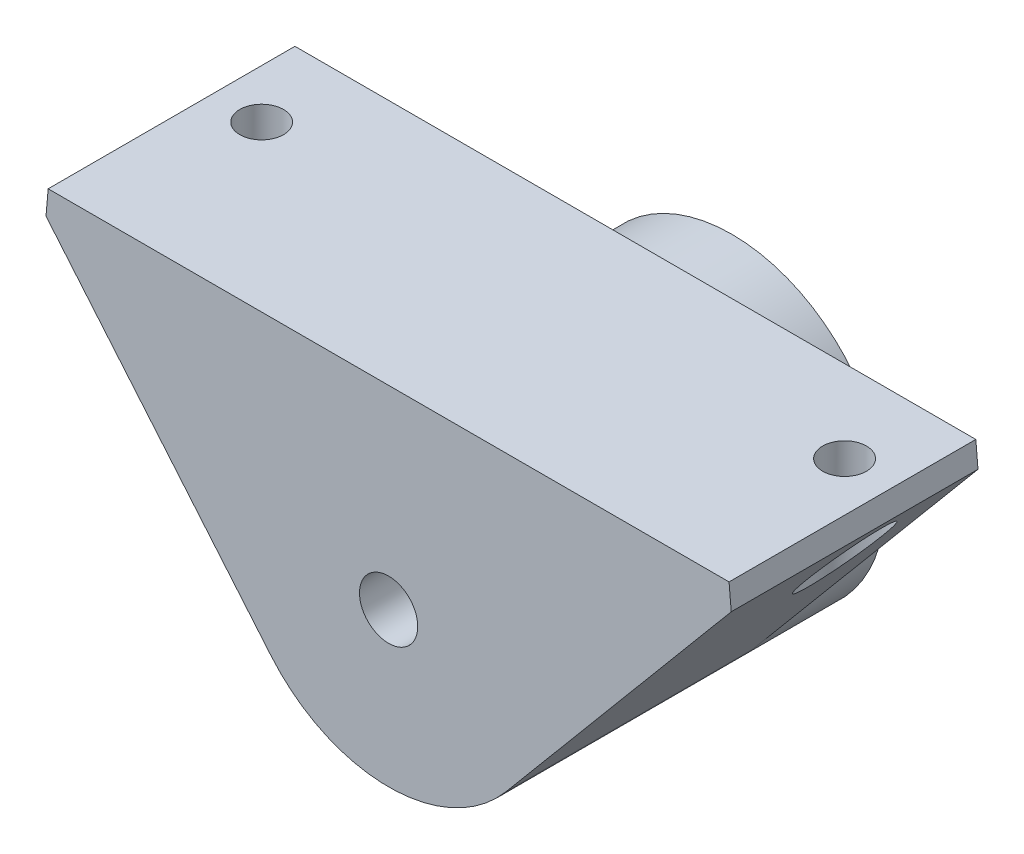
ISO-10303-21;
HEADER;
FILE_DESCRIPTION(('STEP AP214'),'2;1');
FILE_NAME('part.step','',(''),(''),'','','');
FILE_SCHEMA(('AUTOMOTIVE_DESIGN { 1 0 10303 214 1 1 1 1 }'));
ENDSEC;
DATA;
#1=APPLICATION_CONTEXT('core data for automotive mechanical design processes');
#2=APPLICATION_PROTOCOL_DEFINITION('international standard','automotive_design',2000,#1);
#3=PRODUCT_CONTEXT('',#1,'mechanical');
#4=PRODUCT('Part','Part','',(#3));
#5=PRODUCT_RELATED_PRODUCT_CATEGORY('part','',(#4));
#6=PRODUCT_DEFINITION_FORMATION('','',#4);
#7=PRODUCT_DEFINITION_CONTEXT('part definition',#1,'design');
#8=PRODUCT_DEFINITION('design','',#6,#7);
#9=PRODUCT_DEFINITION_SHAPE('','',#8);
#10=(LENGTH_UNIT() NAMED_UNIT(*) SI_UNIT(.MILLI.,.METRE.));
#11=(NAMED_UNIT(*) PLANE_ANGLE_UNIT() SI_UNIT($,.RADIAN.));
#12=(NAMED_UNIT(*) SI_UNIT($,.STERADIAN.) SOLID_ANGLE_UNIT());
#13=UNCERTAINTY_MEASURE_WITH_UNIT(LENGTH_MEASURE(1.E-05),#10,'distance_accuracy_value','');
#14=(GEOMETRIC_REPRESENTATION_CONTEXT(3) GLOBAL_UNCERTAINTY_ASSIGNED_CONTEXT((#13)) GLOBAL_UNIT_ASSIGNED_CONTEXT((#10,
#11,#12)) REPRESENTATION_CONTEXT('',''));
#15=CARTESIAN_POINT('',(0.,0.,0.));
#16=DIRECTION('',(0.,0.,1.));
#17=DIRECTION('',(1.,0.,0.));
#18=AXIS2_PLACEMENT_3D('',#15,#16,#17);
#19=CARTESIAN_POINT('',(0.,0.,-48.));
#20=DIRECTION('',(0.,0.,1.));
#21=DIRECTION('',(1.,0.,0.));
#22=AXIS2_PLACEMENT_3D('',#19,#20,#21);
#23=CYLINDRICAL_SURFACE('',#22,23.7);
#24=DIRECTION('',(0.,0.,1.));
#25=VECTOR('',#24,1.);
#26=CARTESIAN_POINT('',(18.1552533019198,-15.234066349571,-33.1));
#27=LINE('',#26,#25);
#28=CARTESIAN_POINT('',(18.1552533019198,-15.234066349571,-33.1));
#29=VERTEX_POINT('',#28);
#30=CARTESIAN_POINT('',(18.1552533019198,-15.234066349571,5.));
#31=VERTEX_POINT('',#30);
#32=EDGE_CURVE('E118',#29,#31,#27,.T.);
#33=ORIENTED_EDGE('',*,*,#32,.T.);
#34=CARTESIAN_POINT('',(0.,0.,5.));
#35=DIRECTION('',(0.,0.,1.));
#36=DIRECTION('',(1.,0.,0.));
#37=AXIS2_PLACEMENT_3D('',#34,#35,#36);
#38=CIRCLE('',#37,23.7);
#39=CARTESIAN_POINT('',(-18.1552533019198,-15.234066349571,5.));
#40=VERTEX_POINT('',#39);
#41=EDGE_CURVE('E117',#40,#31,#38,.T.);
#42=ORIENTED_EDGE('',*,*,#41,.F.);
#43=DIRECTION('',(0.,0.,1.));
#44=VECTOR('',#43,1.);
#45=CARTESIAN_POINT('',(-18.1552533019198,-15.234066349571,-33.1));
#46=LINE('',#45,#44);
#47=CARTESIAN_POINT('',(-18.1552533019198,-15.234066349571,-33.1));
#48=VERTEX_POINT('',#47);
#49=EDGE_CURVE('E100',#48,#40,#46,.T.);
#50=ORIENTED_EDGE('',*,*,#49,.F.);
#51=CARTESIAN_POINT('',(0.,0.,-33.1));
#52=DIRECTION('',(0.,0.,1.));
#53=DIRECTION('',(1.,0.,0.));
#54=AXIS2_PLACEMENT_3D('',#51,#52,#53);
#55=CIRCLE('',#54,23.7);
#56=EDGE_CURVE('E104',#29,#48,#55,.T.);
#57=ORIENTED_EDGE('',*,*,#56,.F.);
#58=EDGE_LOOP('',(#33,#42,#50,#57));
#59=FACE_BOUND('',#58,.T.);
#60=CARTESIAN_POINT('',(0.,0.,-48.));
#61=DIRECTION('',(0.,0.,1.));
#62=DIRECTION('',(1.,0.,0.));
#63=AXIS2_PLACEMENT_3D('',#60,#61,#62);
#64=CIRCLE('',#63,23.7);
#65=CARTESIAN_POINT('',(23.7,0.,-48.));
#66=VERTEX_POINT('',#65);
#67=EDGE_CURVE('E124',#66,#66,#64,.T.);
#68=ORIENTED_EDGE('',*,*,#67,.T.);
#69=EDGE_LOOP('',(#68));
#70=FACE_BOUND('',#69,.T.);
#71=ADVANCED_FACE('F43',(#59,#70),#23,.T.);
#72=CARTESIAN_POINT('',(0.,0.,-48.));
#73=DIRECTION('',(0.,0.,1.));
#74=DIRECTION('',(1.,0.,0.));
#75=AXIS2_PLACEMENT_3D('',#72,#73,#74);
#76=PLANE('',#75);
#77=ORIENTED_EDGE('',*,*,#67,.F.);
#78=EDGE_LOOP('',(#77));
#79=FACE_BOUND('',#78,.T.);
#80=CARTESIAN_POINT('',(0.,0.,-48.));
#81=DIRECTION('',(0.,0.,1.));
#82=DIRECTION('',(1.,0.,0.));
#83=AXIS2_PLACEMENT_3D('',#80,#81,#82);
#84=CIRCLE('',#83,4.5);
#85=CARTESIAN_POINT('',(4.5,0.,-48.));
#86=VERTEX_POINT('',#85);
#87=EDGE_CURVE('E181',#86,#86,#84,.T.);
#88=ORIENTED_EDGE('',*,*,#87,.T.);
#89=EDGE_LOOP('',(#88));
#90=FACE_BOUND('',#89,.T.);
#91=ADVANCED_FACE('F203',(#79,#90),#76,.F.);
#92=CARTESIAN_POINT('',(0.,0.,5.));
#93=DIRECTION('',(0.,0.,1.));
#94=DIRECTION('',(1.,0.,0.));
#95=AXIS2_PLACEMENT_3D('',#92,#93,#94);
#96=PLANE('',#95);
#97=CARTESIAN_POINT('',(0.,0.,5.));
#98=DIRECTION('',(0.,0.,-1.));
#99=DIRECTION('',(-1.,0.,0.));
#100=AXIS2_PLACEMENT_3D('',#97,#98,#99);
#101=CIRCLE('',#100,4.5);
#102=CARTESIAN_POINT('',(4.5,0.,5.));
#103=VERTEX_POINT('',#102);
#104=EDGE_CURVE('E186',#103,#103,#101,.T.);
#105=ORIENTED_EDGE('',*,*,#104,.T.);
#106=EDGE_LOOP('',(#105));
#107=FACE_BOUND('',#106,.T.);
#108=DIRECTION('',(-0.642787609686538,-0.766044443118979,0.));
#109=VECTOR('',#108,1.);
#110=CARTESIAN_POINT('',(18.1552533019198,-15.234066349571,5.));
#111=LINE('',#110,#109);
#112=CARTESIAN_POINT('',(52.8972036440606,26.1697777844051,5.));
#113=VERTEX_POINT('',#112);
#114=EDGE_CURVE('E166',#113,#31,#111,.T.);
#115=ORIENTED_EDGE('',*,*,#114,.F.);
#116=DIRECTION('',(0.0871557427476541,-0.996194698091746,0.));
#117=VECTOR('',#116,1.);
#118=CARTESIAN_POINT('',(54.7675570638037,4.79154037209174,5.));
#119=LINE('',#118,#117);
#120=CARTESIAN_POINT('',(52.5621026214109,30.,5.));
#121=VERTEX_POINT('',#120);
#122=EDGE_CURVE('E146',#113,#121,#119,.F.);
#123=ORIENTED_EDGE('',*,*,#122,.T.);
#124=DIRECTION('',(1.,0.,0.));
#125=VECTOR('',#124,1.);
#126=CARTESIAN_POINT('',(0.,30.,5.));
#127=LINE('',#126,#125);
#128=CARTESIAN_POINT('',(-52.5621026214109,30.,5.));
#129=VERTEX_POINT('',#128);
#130=EDGE_CURVE('E165',#129,#121,#127,.T.);
#131=ORIENTED_EDGE('',*,*,#130,.F.);
#132=DIRECTION('',(-0.0871557427476587,-0.996194698091746,0.));
#133=VECTOR('',#132,1.);
#134=CARTESIAN_POINT('',(-54.7675570638037,4.791540372092,5.));
#135=LINE('',#134,#133);
#136=CARTESIAN_POINT('',(-52.8972036440606,26.1697777844051,5.));
#137=VERTEX_POINT('',#136);
#138=EDGE_CURVE('E144',#129,#137,#135,.T.);
#139=ORIENTED_EDGE('',*,*,#138,.T.);
#140=DIRECTION('',(0.642787609686538,-0.766044443118979,0.));
#141=VECTOR('',#140,1.);
#142=CARTESIAN_POINT('',(-18.1552533019198,-15.234066349571,5.));
#143=LINE('',#142,#141);
#144=EDGE_CURVE('E159',#137,#40,#143,.T.);
#145=ORIENTED_EDGE('',*,*,#144,.T.);
#146=ORIENTED_EDGE('',*,*,#41,.T.);
#147=EDGE_LOOP('',(#115,#123,#131,#139,#145,#146));
#148=FACE_BOUND('',#147,.T.);
#149=ADVANCED_FACE('F164',(#107,#148),#96,.T.);
#150=CARTESIAN_POINT('',(18.1552533019198,-15.234066349571,-33.1));
#151=DIRECTION('',(-0.766044443118979,0.642787609686538,0.));
#152=DIRECTION('',(-0.642787609686538,-0.766044443118979,0.));
#153=AXIS2_PLACEMENT_3D('',#150,#151,#152);
#154=PLANE('',#153);
#155=CARTESIAN_POINT('',(45.,16.7582569701478,-20.4));
#156=DIRECTION('',(-0.766044443118979,0.642787609686538,0.));
#157=DIRECTION('',(0.642787609686538,0.766044443118979,0.));
#158=AXIS2_PLACEMENT_3D('',#155,#156,#157);
#159=ELLIPSE('',#158,8.89096167050728,5.715);
#160=CARTESIAN_POINT('',(50.715,23.5691287518237,-20.4));
#161=VERTEX_POINT('',#160);
#162=EDGE_CURVE('E138',#161,#161,#159,.T.);
#163=ORIENTED_EDGE('',*,*,#162,.T.);
#164=EDGE_LOOP('',(#163));
#165=FACE_BOUND('',#164,.T.);
#166=DIRECTION('',(-0.642787609686538,-0.766044443118979,0.));
#167=VECTOR('',#166,1.);
#168=CARTESIAN_POINT('',(18.1552533019198,-15.234066349571,-33.1));
#169=LINE('',#168,#167);
#170=CARTESIAN_POINT('',(52.8972036440606,26.1697777844051,-33.1));
#171=VERTEX_POINT('',#170);
#172=EDGE_CURVE('E110',#171,#29,#169,.T.);
#173=ORIENTED_EDGE('',*,*,#172,.F.);
#174=DIRECTION('',(0.,0.,1.));
#175=VECTOR('',#174,1.);
#176=CARTESIAN_POINT('',(52.8972036440606,26.1697777844051,-33.1));
#177=LINE('',#176,#175);
#178=EDGE_CURVE('E127',#171,#113,#177,.T.);
#179=ORIENTED_EDGE('',*,*,#178,.T.);
#180=ORIENTED_EDGE('',*,*,#114,.T.);
#181=ORIENTED_EDGE('',*,*,#32,.F.);
#182=EDGE_LOOP('',(#173,#179,#180,#181));
#183=FACE_BOUND('',#182,.T.);
#184=ADVANCED_FACE('F157',(#165,#183),#154,.F.);
#185=CARTESIAN_POINT('',(-18.1552533019198,-15.234066349571,-33.1));
#186=DIRECTION('',(-0.766044443118979,-0.642787609686538,0.));
#187=DIRECTION('',(0.642787609686538,-0.766044443118979,0.));
#188=AXIS2_PLACEMENT_3D('',#185,#186,#187);
#189=PLANE('',#188);
#190=CARTESIAN_POINT('',(-45.,16.7582569701478,-20.4));
#191=DIRECTION('',(-0.766044443118979,-0.642787609686538,0.));
#192=DIRECTION('',(-0.642787609686538,0.766044443118979,0.));
#193=AXIS2_PLACEMENT_3D('',#190,#191,#192);
#194=ELLIPSE('',#193,8.89096167050727,5.715);
#195=CARTESIAN_POINT('',(-50.715,23.5691287518237,-20.4));
#196=VERTEX_POINT('',#195);
#197=EDGE_CURVE('E135',#196,#196,#194,.T.);
#198=ORIENTED_EDGE('',*,*,#197,.F.);
#199=EDGE_LOOP('',(#198));
#200=FACE_BOUND('',#199,.T.);
#201=ORIENTED_EDGE('',*,*,#144,.F.);
#202=DIRECTION('',(0.,0.,-1.));
#203=VECTOR('',#202,1.);
#204=CARTESIAN_POINT('',(-52.8972036440606,26.1697777844051,-33.1));
#205=LINE('',#204,#203);
#206=CARTESIAN_POINT('',(-52.8972036440606,26.1697777844051,-33.1));
#207=VERTEX_POINT('',#206);
#208=EDGE_CURVE('E11',#137,#207,#205,.T.);
#209=ORIENTED_EDGE('',*,*,#208,.T.);
#210=DIRECTION('',(0.642787609686538,-0.766044443118979,0.));
#211=VECTOR('',#210,1.);
#212=CARTESIAN_POINT('',(-18.1552533019198,-15.234066349571,-33.1));
#213=LINE('',#212,#211);
#214=EDGE_CURVE('E96',#207,#48,#213,.T.);
#215=ORIENTED_EDGE('',*,*,#214,.T.);
#216=ORIENTED_EDGE('',*,*,#49,.T.);
#217=EDGE_LOOP('',(#201,#209,#215,#216));
#218=FACE_BOUND('',#217,.T.);
#219=ADVANCED_FACE('F98',(#200,#218),#189,.T.);
#220=CARTESIAN_POINT('',(0.,30.,-33.1));
#221=DIRECTION('',(0.,-1.,0.));
#222=DIRECTION('',(1.,0.,0.));
#223=AXIS2_PLACEMENT_3D('',#220,#221,#222);
#224=PLANE('',#223);
#225=CARTESIAN_POINT('',(-45.,30.,-20.4));
#226=DIRECTION('',(0.,1.,0.));
#227=DIRECTION('',(0.,0.,1.));
#228=AXIS2_PLACEMENT_3D('',#225,#226,#227);
#229=CIRCLE('',#228,3.3782);
#230=CARTESIAN_POINT('',(-45.,30.,-17.0218));
#231=VERTEX_POINT('',#230);
#232=EDGE_CURVE('E141',#231,#231,#229,.T.);
#233=ORIENTED_EDGE('',*,*,#232,.F.);
#234=EDGE_LOOP('',(#233));
#235=FACE_BOUND('',#234,.T.);
#236=CARTESIAN_POINT('',(45.,30.,-20.4));
#237=DIRECTION('',(0.,1.,0.));
#238=DIRECTION('',(0.,0.,1.));
#239=AXIS2_PLACEMENT_3D('',#236,#237,#238);
#240=CIRCLE('',#239,3.3782);
#241=CARTESIAN_POINT('',(45.,30.,-17.0218));
#242=VERTEX_POINT('',#241);
#243=EDGE_CURVE('E170',#242,#242,#240,.T.);
#244=ORIENTED_EDGE('',*,*,#243,.F.);
#245=EDGE_LOOP('',(#244));
#246=FACE_BOUND('',#245,.T.);
#247=ORIENTED_EDGE('',*,*,#130,.T.);
#248=DIRECTION('',(0.,0.,-1.));
#249=VECTOR('',#248,1.);
#250=CARTESIAN_POINT('',(52.5621026214109,30.,-33.1));
#251=LINE('',#250,#249);
#252=CARTESIAN_POINT('',(52.5621026214109,30.,-33.1));
#253=VERTEX_POINT('',#252);
#254=EDGE_CURVE('E65',#121,#253,#251,.T.);
#255=ORIENTED_EDGE('',*,*,#254,.T.);
#256=DIRECTION('',(1.,0.,0.));
#257=VECTOR('',#256,1.);
#258=CARTESIAN_POINT('',(0.,30.,-33.1));
#259=LINE('',#258,#257);
#260=CARTESIAN_POINT('',(-52.5621026214109,30.,-33.1));
#261=VERTEX_POINT('',#260);
#262=EDGE_CURVE('E105',#261,#253,#259,.T.);
#263=ORIENTED_EDGE('',*,*,#262,.F.);
#264=DIRECTION('',(0.,0.,1.));
#265=VECTOR('',#264,1.);
#266=CARTESIAN_POINT('',(-52.5621026214109,30.,5.));
#267=LINE('',#266,#265);
#268=EDGE_CURVE('E148',#261,#129,#267,.T.);
#269=ORIENTED_EDGE('',*,*,#268,.T.);
#270=EDGE_LOOP('',(#247,#255,#263,#269));
#271=FACE_BOUND('',#270,.T.);
#272=ADVANCED_FACE('F167',(#235,#246,#271),#224,.F.);
#273=CARTESIAN_POINT('',(0.,0.,-33.1));
#274=DIRECTION('',(0.,0.,1.));
#275=DIRECTION('',(1.,0.,0.));
#276=AXIS2_PLACEMENT_3D('',#273,#274,#275);
#277=PLANE('',#276);
#278=ORIENTED_EDGE('',*,*,#262,.T.);
#279=DIRECTION('',(-0.0871557427476541,0.996194698091746,0.));
#280=VECTOR('',#279,1.);
#281=CARTESIAN_POINT('',(52.8972036440606,26.1697777844051,-33.1));
#282=LINE('',#281,#280);
#283=EDGE_CURVE('E52',#253,#171,#282,.F.);
#284=ORIENTED_EDGE('',*,*,#283,.T.);
#285=ORIENTED_EDGE('',*,*,#172,.T.);
#286=ORIENTED_EDGE('',*,*,#56,.T.);
#287=ORIENTED_EDGE('',*,*,#214,.F.);
#288=DIRECTION('',(0.0871557427476587,0.996194698091746,0.));
#289=VECTOR('',#288,1.);
#290=CARTESIAN_POINT('',(-52.5621026214109,30.,-33.1));
#291=LINE('',#290,#289);
#292=EDGE_CURVE('E152',#207,#261,#291,.T.);
#293=ORIENTED_EDGE('',*,*,#292,.T.);
#294=EDGE_LOOP('',(#278,#284,#285,#286,#287,#293));
#295=FACE_BOUND('',#294,.T.);
#296=ADVANCED_FACE('F108',(#295),#277,.F.);
#297=CARTESIAN_POINT('',(45.,30.,-20.4));
#298=DIRECTION('',(0.,1.,0.));
#299=DIRECTION('',(0.,0.,1.));
#300=AXIS2_PLACEMENT_3D('',#297,#298,#299);
#301=CYLINDRICAL_SURFACE('',#300,3.37819999999999);
#302=CARTESIAN_POINT('',(45.,25.,-20.4));
#303=DIRECTION('',(0.,1.,0.));
#304=DIRECTION('',(-1.,0.,0.));
#305=AXIS2_PLACEMENT_3D('',#302,#303,#304);
#306=CIRCLE('',#305,3.37819999999999);
#307=CARTESIAN_POINT('',(41.6218,25.,-20.4));
#308=VERTEX_POINT('',#307);
#309=EDGE_CURVE('E131',#308,#308,#306,.F.);
#310=ORIENTED_EDGE('',*,*,#309,.T.);
#311=EDGE_LOOP('',(#310));
#312=FACE_BOUND('',#311,.T.);
#313=ORIENTED_EDGE('',*,*,#243,.T.);
#314=EDGE_LOOP('',(#313));
#315=FACE_BOUND('',#314,.T.);
#316=ADVANCED_FACE('F239',(#312,#315),#301,.F.);
#317=CARTESIAN_POINT('',(-45.,30.,-20.4));
#318=DIRECTION('',(0.,1.,0.));
#319=DIRECTION('',(0.,0.,1.));
#320=AXIS2_PLACEMENT_3D('',#317,#318,#319);
#321=CYLINDRICAL_SURFACE('',#320,3.37819999999999);
#322=CARTESIAN_POINT('',(-45.,25.,-20.4));
#323=DIRECTION('',(0.,1.,0.));
#324=DIRECTION('',(-1.,0.,0.));
#325=AXIS2_PLACEMENT_3D('',#322,#323,#324);
#326=CIRCLE('',#325,3.37819999999999);
#327=CARTESIAN_POINT('',(-48.3782,25.,-20.4));
#328=VERTEX_POINT('',#327);
#329=EDGE_CURVE('E128',#328,#328,#326,.F.);
#330=ORIENTED_EDGE('',*,*,#329,.T.);
#331=EDGE_LOOP('',(#330));
#332=FACE_BOUND('',#331,.T.);
#333=ORIENTED_EDGE('',*,*,#232,.T.);
#334=EDGE_LOOP('',(#333));
#335=FACE_BOUND('',#334,.T.);
#336=ADVANCED_FACE('F235',(#332,#335),#321,.F.);
#337=CARTESIAN_POINT('',(-45.,25.,-20.4));
#338=DIRECTION('',(0.,1.,0.));
#339=DIRECTION('',(-1.,0.,0.));
#340=AXIS2_PLACEMENT_3D('',#337,#338,#339);
#341=PLANE('',#340);
#342=CARTESIAN_POINT('',(-45.,25.,-20.4));
#343=DIRECTION('',(0.,1.,0.));
#344=DIRECTION('',(-1.,0.,0.));
#345=AXIS2_PLACEMENT_3D('',#342,#343,#344);
#346=CIRCLE('',#345,5.715);
#347=CARTESIAN_POINT('',(-50.715,25.,-20.4));
#348=VERTEX_POINT('',#347);
#349=EDGE_CURVE('E132',#348,#348,#346,.T.);
#350=ORIENTED_EDGE('',*,*,#349,.F.);
#351=EDGE_LOOP('',(#350));
#352=FACE_BOUND('',#351,.T.);
#353=ORIENTED_EDGE('',*,*,#329,.F.);
#354=EDGE_LOOP('',(#353));
#355=FACE_BOUND('',#354,.T.);
#356=ADVANCED_FACE('F238',(#352,#355),#341,.F.);
#357=CARTESIAN_POINT('',(-45.,-23.7,-20.4));
#358=DIRECTION('',(0.,1.,0.));
#359=DIRECTION('',(-1.,0.,0.));
#360=AXIS2_PLACEMENT_3D('',#357,#358,#359);
#361=CYLINDRICAL_SURFACE('',#360,5.715);
#362=ORIENTED_EDGE('',*,*,#197,.T.);
#363=EDGE_LOOP('',(#362));
#364=FACE_BOUND('',#363,.T.);
#365=ORIENTED_EDGE('',*,*,#349,.T.);
#366=EDGE_LOOP('',(#365));
#367=FACE_BOUND('',#366,.T.);
#368=ADVANCED_FACE('F228',(#364,#367),#361,.F.);
#369=CARTESIAN_POINT('',(45.,-23.7,-20.4));
#370=DIRECTION('',(0.,1.,0.));
#371=DIRECTION('',(-1.,0.,0.));
#372=AXIS2_PLACEMENT_3D('',#369,#370,#371);
#373=CYLINDRICAL_SURFACE('',#372,5.715);
#374=CARTESIAN_POINT('',(45.,25.,-20.4));
#375=DIRECTION('',(0.,1.,0.));
#376=DIRECTION('',(-1.,0.,0.));
#377=AXIS2_PLACEMENT_3D('',#374,#375,#376);
#378=CIRCLE('',#377,5.715);
#379=CARTESIAN_POINT('',(39.285,25.,-20.4));
#380=VERTEX_POINT('',#379);
#381=EDGE_CURVE('E178',#380,#380,#378,.T.);
#382=ORIENTED_EDGE('',*,*,#381,.T.);
#383=EDGE_LOOP('',(#382));
#384=FACE_BOUND('',#383,.T.);
#385=ORIENTED_EDGE('',*,*,#162,.F.);
#386=EDGE_LOOP('',(#385));
#387=FACE_BOUND('',#386,.T.);
#388=ADVANCED_FACE('F221',(#384,#387),#373,.F.);
#389=CARTESIAN_POINT('',(45.,25.,-20.4));
#390=DIRECTION('',(0.,1.,0.));
#391=DIRECTION('',(-1.,0.,0.));
#392=AXIS2_PLACEMENT_3D('',#389,#390,#391);
#393=PLANE('',#392);
#394=ORIENTED_EDGE('',*,*,#381,.F.);
#395=EDGE_LOOP('',(#394));
#396=FACE_BOUND('',#395,.T.);
#397=ORIENTED_EDGE('',*,*,#309,.F.);
#398=EDGE_LOOP('',(#397));
#399=FACE_BOUND('',#398,.T.);
#400=ADVANCED_FACE('F216',(#396,#399),#393,.F.);
#401=CARTESIAN_POINT('',(52.8972036440606,26.1697777844051,-33.1));
#402=DIRECTION('',(-0.996194698091746,-0.0871557427476541,0.));
#403=DIRECTION('',(0.,0.,1.));
#404=AXIS2_PLACEMENT_3D('',#401,#402,#403);
#405=PLANE('',#404);
#406=ORIENTED_EDGE('',*,*,#283,.F.);
#407=ORIENTED_EDGE('',*,*,#254,.F.);
#408=ORIENTED_EDGE('',*,*,#122,.F.);
#409=ORIENTED_EDGE('',*,*,#178,.F.);
#410=EDGE_LOOP('',(#406,#407,#408,#409));
#411=FACE_BOUND('',#410,.T.);
#412=ADVANCED_FACE('F161',(#411),#405,.F.);
#413=CARTESIAN_POINT('',(-52.5621026214109,30.,-33.1));
#414=DIRECTION('',(-0.996194698091746,0.0871557427476587,0.));
#415=DIRECTION('',(0.,0.,-1.));
#416=AXIS2_PLACEMENT_3D('',#413,#414,#415);
#417=PLANE('',#416);
#418=ORIENTED_EDGE('',*,*,#292,.F.);
#419=ORIENTED_EDGE('',*,*,#208,.F.);
#420=ORIENTED_EDGE('',*,*,#138,.F.);
#421=ORIENTED_EDGE('',*,*,#268,.F.);
#422=EDGE_LOOP('',(#418,#419,#420,#421));
#423=FACE_BOUND('',#422,.T.);
#424=ADVANCED_FACE('F46',(#423),#417,.T.);
#425=CARTESIAN_POINT('',(0.,0.,-100.891587232754));
#426=DIRECTION('',(0.,0.,1.));
#427=DIRECTION('',(1.,0.,0.));
#428=AXIS2_PLACEMENT_3D('',#425,#426,#427);
#429=CYLINDRICAL_SURFACE('',#428,4.5);
#430=CARTESIAN_POINT('',(4.5,0.,-48.));
#431=CARTESIAN_POINT('',(4.5,0.,-47.4479166666667));
#432=CARTESIAN_POINT('',(4.5,0.,-46.8958333333333));
#433=CARTESIAN_POINT('',(4.5,0.,-45.7916666666667));
#434=CARTESIAN_POINT('',(4.5,0.,-45.2395833333333));
#435=CARTESIAN_POINT('',(4.5,0.,-44.1354166666667));
#436=CARTESIAN_POINT('',(4.5,0.,-43.5833333333333));
#437=CARTESIAN_POINT('',(4.5,0.,-42.4791666666667));
#438=CARTESIAN_POINT('',(4.5,0.,-41.9270833333333));
#439=CARTESIAN_POINT('',(4.5,0.,-40.8229166666667));
#440=CARTESIAN_POINT('',(4.5,0.,-40.2708333333333));
#441=CARTESIAN_POINT('',(4.5,0.,-39.1666666666667));
#442=CARTESIAN_POINT('',(4.5,0.,-38.6145833333333));
#443=CARTESIAN_POINT('',(4.5,0.,-37.5104166666667));
#444=CARTESIAN_POINT('',(4.5,0.,-36.9583333333333));
#445=CARTESIAN_POINT('',(4.5,0.,-35.8541666666667));
#446=CARTESIAN_POINT('',(4.5,0.,-35.3020833333333));
#447=CARTESIAN_POINT('',(4.5,0.,-34.1979166666667));
#448=CARTESIAN_POINT('',(4.5,0.,-33.6458333333333));
#449=CARTESIAN_POINT('',(4.5,0.,-32.5416666666667));
#450=CARTESIAN_POINT('',(4.5,0.,-31.9895833333333));
#451=CARTESIAN_POINT('',(4.5,0.,-30.8854166666667));
#452=CARTESIAN_POINT('',(4.5,0.,-30.3333333333333));
#453=CARTESIAN_POINT('',(4.5,0.,-29.2291666666667));
#454=CARTESIAN_POINT('',(4.5,0.,-28.6770833333333));
#455=CARTESIAN_POINT('',(4.5,0.,-27.5729166666667));
#456=CARTESIAN_POINT('',(4.5,0.,-27.0208333333333));
#457=CARTESIAN_POINT('',(4.5,0.,-25.9166666666667));
#458=CARTESIAN_POINT('',(4.5,0.,-25.3645833333333));
#459=CARTESIAN_POINT('',(4.5,0.,-24.2604166666667));
#460=CARTESIAN_POINT('',(4.5,0.,-23.7083333333333));
#461=CARTESIAN_POINT('',(4.5,0.,-22.6041666666667));
#462=CARTESIAN_POINT('',(4.5,0.,-22.0520833333333));
#463=CARTESIAN_POINT('',(4.5,0.,-20.9479166666667));
#464=CARTESIAN_POINT('',(4.5,0.,-20.3958333333333));
#465=CARTESIAN_POINT('',(4.5,0.,-19.2916666666667));
#466=CARTESIAN_POINT('',(4.5,0.,-18.7395833333333));
#467=CARTESIAN_POINT('',(4.5,0.,-17.6354166666667));
#468=CARTESIAN_POINT('',(4.5,0.,-17.0833333333333));
#469=CARTESIAN_POINT('',(4.5,0.,-15.9791666666667));
#470=CARTESIAN_POINT('',(4.5,0.,-15.4270833333333));
#471=CARTESIAN_POINT('',(4.5,0.,-14.3229166666667));
#472=CARTESIAN_POINT('',(4.5,0.,-13.7708333333333));
#473=CARTESIAN_POINT('',(4.5,0.,-12.6666666666667));
#474=CARTESIAN_POINT('',(4.5,0.,-12.1145833333333));
#475=CARTESIAN_POINT('',(4.5,0.,-11.0104166666667));
#476=CARTESIAN_POINT('',(4.5,0.,-10.4583333333333));
#477=CARTESIAN_POINT('',(4.5,0.,-9.35416666666667));
#478=CARTESIAN_POINT('',(4.5,0.,-8.80208333333334));
#479=CARTESIAN_POINT('',(4.5,0.,-7.69791666666667));
#480=CARTESIAN_POINT('',(4.5,0.,-7.14583333333334));
#481=CARTESIAN_POINT('',(4.5,0.,-6.04166666666667));
#482=CARTESIAN_POINT('',(4.5,0.,-5.48958333333333));
#483=CARTESIAN_POINT('',(4.5,0.,-4.38541666666667));
#484=CARTESIAN_POINT('',(4.5,0.,-3.83333333333333));
#485=CARTESIAN_POINT('',(4.5,0.,-2.72916666666667));
#486=CARTESIAN_POINT('',(4.5,0.,-2.17708333333333));
#487=CARTESIAN_POINT('',(4.5,0.,-1.07291666666666));
#488=CARTESIAN_POINT('',(4.5,0.,-0.520833333333327));
#489=CARTESIAN_POINT('',(4.5,0.,0.583333333333343));
#490=CARTESIAN_POINT('',(4.5,0.,1.13541666666668));
#491=CARTESIAN_POINT('',(4.5,0.,2.23958333333334));
#492=CARTESIAN_POINT('',(4.5,0.,2.79166666666667));
#493=CARTESIAN_POINT('',(4.5,0.,3.89583333333334));
#494=CARTESIAN_POINT('',(4.5,0.,4.44791666666667));
#495=CARTESIAN_POINT('',(4.5,0.,5.));
#496=B_SPLINE_CURVE_WITH_KNOTS('',3,(#430,#431,#432,#433,#434,#435,#436,#437,#438,#439,#440,
#441,#442,#443,#444,#445,#446,#447,#448,#449,#450,#451,#452,#453,#454,#455,#456,#457,#458,#459,
#460,#461,#462,#463,#464,#465,#466,#467,#468,#469,#470,#471,#472,#473,#474,#475,#476,#477,#478,
#479,#480,#481,#482,#483,#484,#485,#486,#487,#488,#489,#490,#491,#492,#493,#494,#495),
.UNSPECIFIED.,.F.,.F.,(4,2,2,2,2,2,2,2,2,2,2,2,2,2,2,2,2,2,2,2,2,2,2,2,2,2,2,2,2,2,2,2,4),(0.,
1.65625,3.3125,4.96875,6.62500000000001,8.28125,9.93749999999999,11.59375,13.25,14.90625,
16.5625,18.21875,19.875,21.53125,23.1875,24.84375,26.5,28.15625,29.8125,31.46875,33.125,
34.78125,36.4375,38.09375,39.75,41.40625,43.0625,44.71875,46.375,48.03125,49.6875,51.34375,53.),.UNSPECIFIED.);
#497=EDGE_CURVE('BSEAM191',#86,#103,#496,.T.);
#498=ORIENTED_EDGE('',*,*,#87,.F.);
#499=ORIENTED_EDGE('',*,*,#104,.F.);
#500=ORIENTED_EDGE('',*,*,#497,.T.);
#501=ORIENTED_EDGE('',*,*,#497,.F.);
#502=EDGE_LOOP('',(#498,#500,#499,#501));
#503=FACE_BOUND('',#502,.T.);
#504=ADVANCED_FACE('F191',(#503),#429,.F.);
#505=CLOSED_SHELL('',(#71,#91,#149,#184,#219,#272,#296,#316,#336,#356,#368,#388,#400,#412,#424,#504));
#506=MANIFOLD_SOLID_BREP('B2',#505);
#507=ADVANCED_BREP_SHAPE_REPRESENTATION('',(#18,#506),#14);
#508=SHAPE_DEFINITION_REPRESENTATION(#9,#507);
ENDSEC;
END-ISO-10303-21;
